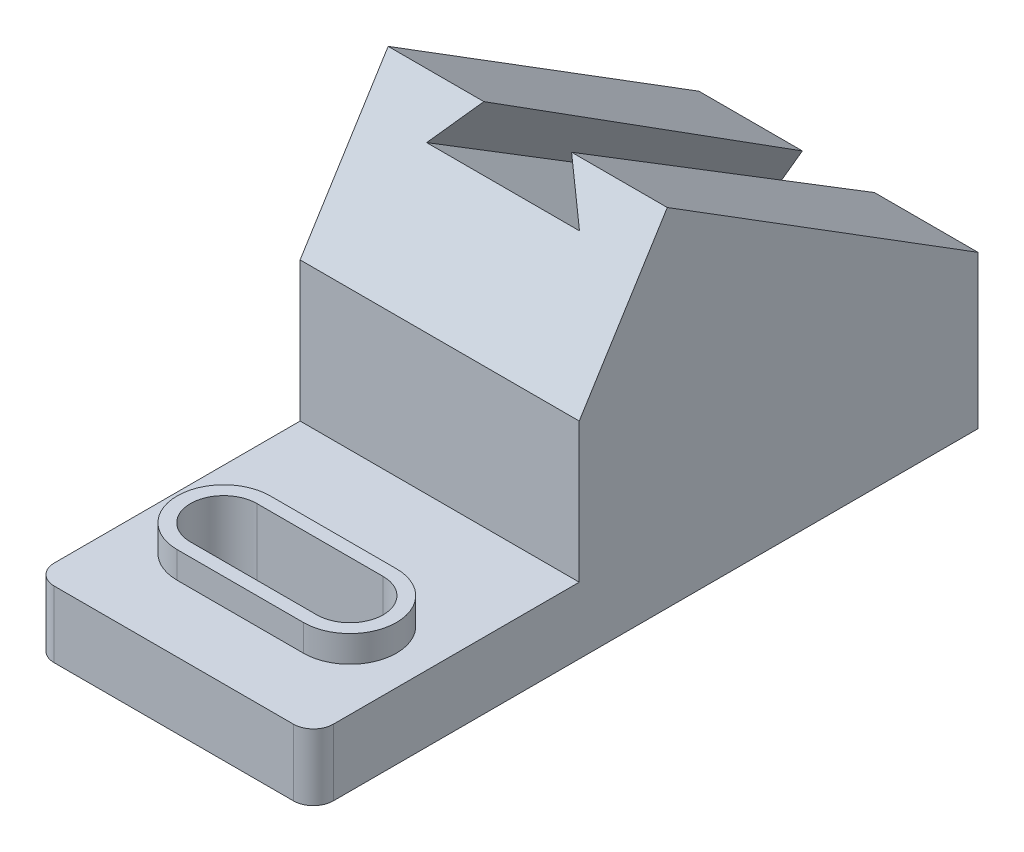
ISO-10303-21;
HEADER;
FILE_DESCRIPTION(('STEP AP214'),'2;1');
FILE_NAME('part.step','',(''),(''),'','','');
FILE_SCHEMA(('AUTOMOTIVE_DESIGN { 1 0 10303 214 1 1 1 1 }'));
ENDSEC;
DATA;
#1=APPLICATION_CONTEXT('core data for automotive mechanical design processes');
#2=APPLICATION_PROTOCOL_DEFINITION('international standard','automotive_design',2000,#1);
#3=PRODUCT_CONTEXT('',#1,'mechanical');
#4=PRODUCT('Part','Part','',(#3));
#5=PRODUCT_RELATED_PRODUCT_CATEGORY('part','',(#4));
#6=PRODUCT_DEFINITION_FORMATION('','',#4);
#7=PRODUCT_DEFINITION_CONTEXT('part definition',#1,'design');
#8=PRODUCT_DEFINITION('design','',#6,#7);
#9=PRODUCT_DEFINITION_SHAPE('','',#8);
#10=(LENGTH_UNIT() NAMED_UNIT(*) SI_UNIT(.MILLI.,.METRE.));
#11=(NAMED_UNIT(*) PLANE_ANGLE_UNIT() SI_UNIT($,.RADIAN.));
#12=(NAMED_UNIT(*) SI_UNIT($,.STERADIAN.) SOLID_ANGLE_UNIT());
#13=UNCERTAINTY_MEASURE_WITH_UNIT(LENGTH_MEASURE(1.E-05),#10,'distance_accuracy_value','');
#14=(GEOMETRIC_REPRESENTATION_CONTEXT(3) GLOBAL_UNCERTAINTY_ASSIGNED_CONTEXT((#13)) GLOBAL_UNIT_ASSIGNED_CONTEXT((#10,
#11,#12)) REPRESENTATION_CONTEXT('',''));
#15=CARTESIAN_POINT('',(0.,0.,0.));
#16=DIRECTION('',(0.,0.,1.));
#17=DIRECTION('',(1.,0.,0.));
#18=AXIS2_PLACEMENT_3D('',#15,#16,#17);
#19=CARTESIAN_POINT('',(21.,9.99999999999999,100.));
#20=DIRECTION('',(0.,-1.,0.));
#21=DIRECTION('',(0.,0.,-1.));
#22=AXIS2_PLACEMENT_3D('',#19,#20,#21);
#23=PLANE('',#22);
#24=DIRECTION('',(0.,0.,1.));
#25=VECTOR('',#24,1.);
#26=CARTESIAN_POINT('',(-21.,9.99999999999999,100.));
#27=LINE('',#26,#25);
#28=CARTESIAN_POINT('',(-21.,9.99999999999999,60.));
#29=VERTEX_POINT('',#28);
#30=CARTESIAN_POINT('',(-21.,9.99999999999999,97.));
#31=VERTEX_POINT('',#30);
#32=EDGE_CURVE('E350',#29,#31,#27,.T.);
#33=ORIENTED_EDGE('',*,*,#32,.T.);
#34=CARTESIAN_POINT('',(-18.,9.99999999999999,97.));
#35=DIRECTION('',(0.,1.,0.));
#36=DIRECTION('',(0.,0.,1.));
#37=AXIS2_PLACEMENT_3D('',#34,#35,#36);
#38=CIRCLE('',#37,3.);
#39=CARTESIAN_POINT('',(-18.,9.99999999999999,100.));
#40=VERTEX_POINT('',#39);
#41=EDGE_CURVE('E284',#31,#40,#38,.T.);
#42=ORIENTED_EDGE('',*,*,#41,.T.);
#43=DIRECTION('',(-1.,0.,0.));
#44=VECTOR('',#43,1.);
#45=CARTESIAN_POINT('',(21.,9.99999999999999,100.));
#46=LINE('',#45,#44);
#47=CARTESIAN_POINT('',(18.,9.99999999999999,100.));
#48=VERTEX_POINT('',#47);
#49=EDGE_CURVE('E357',#48,#40,#46,.T.);
#50=ORIENTED_EDGE('',*,*,#49,.F.);
#51=CARTESIAN_POINT('',(18.,9.99999999999999,97.));
#52=DIRECTION('',(0.,1.,0.));
#53=DIRECTION('',(0.,0.,1.));
#54=AXIS2_PLACEMENT_3D('',#51,#52,#53);
#55=CIRCLE('',#54,2.99999999999999);
#56=CARTESIAN_POINT('',(21.,9.99999999999999,97.));
#57=VERTEX_POINT('',#56);
#58=EDGE_CURVE('E270',#57,#48,#55,.F.);
#59=ORIENTED_EDGE('',*,*,#58,.F.);
#60=DIRECTION('',(0.,0.,1.));
#61=VECTOR('',#60,1.);
#62=CARTESIAN_POINT('',(21.,9.99999999999999,100.));
#63=LINE('',#62,#61);
#64=CARTESIAN_POINT('',(21.,9.99999999999999,60.));
#65=VERTEX_POINT('',#64);
#66=EDGE_CURVE('E335',#65,#57,#63,.T.);
#67=ORIENTED_EDGE('',*,*,#66,.F.);
#68=DIRECTION('',(-1.,0.,0.));
#69=VECTOR('',#68,1.);
#70=CARTESIAN_POINT('',(21.,9.99999999999999,60.));
#71=LINE('',#70,#69);
#72=EDGE_CURVE('E356',#65,#29,#71,.T.);
#73=ORIENTED_EDGE('',*,*,#72,.T.);
#74=EDGE_LOOP('',(#33,#42,#50,#59,#67,#73));
#75=FACE_BOUND('',#74,.T.);
#76=CARTESIAN_POINT('',(-9.5,9.99999999999999,83.));
#77=DIRECTION('',(0.,1.,0.));
#78=DIRECTION('',(0.,0.,1.));
#79=AXIS2_PLACEMENT_3D('',#76,#77,#78);
#80=CIRCLE('',#79,7.00000000000001);
#81=CARTESIAN_POINT('',(-9.5,9.99999999999999,76.));
#82=VERTEX_POINT('',#81);
#83=CARTESIAN_POINT('',(-9.5,9.99999999999999,90.));
#84=VERTEX_POINT('',#83);
#85=EDGE_CURVE('E79',#82,#84,#80,.T.);
#86=ORIENTED_EDGE('',*,*,#85,.F.);
#87=DIRECTION('',(1.,0.,0.));
#88=VECTOR('',#87,1.);
#89=CARTESIAN_POINT('',(0.,9.99999999999999,76.));
#90=LINE('',#89,#88);
#91=CARTESIAN_POINT('',(9.5,9.99999999999999,76.));
#92=VERTEX_POINT('',#91);
#93=EDGE_CURVE('E252',#82,#92,#90,.T.);
#94=ORIENTED_EDGE('',*,*,#93,.T.);
#95=CARTESIAN_POINT('',(9.5,9.99999999999999,83.));
#96=DIRECTION('',(0.,1.,0.));
#97=DIRECTION('',(0.,0.,1.));
#98=AXIS2_PLACEMENT_3D('',#95,#96,#97);
#99=CIRCLE('',#98,7.00000000000001);
#100=CARTESIAN_POINT('',(9.5,9.99999999999999,90.));
#101=VERTEX_POINT('',#100);
#102=EDGE_CURVE('E232',#101,#92,#99,.T.);
#103=ORIENTED_EDGE('',*,*,#102,.F.);
#104=DIRECTION('',(1.,0.,0.));
#105=VECTOR('',#104,1.);
#106=CARTESIAN_POINT('',(0.,9.99999999999999,90.));
#107=LINE('',#106,#105);
#108=EDGE_CURVE('E83',#84,#101,#107,.T.);
#109=ORIENTED_EDGE('',*,*,#108,.F.);
#110=EDGE_LOOP('',(#86,#94,#103,#109));
#111=FACE_BOUND('',#110,.T.);
#112=ADVANCED_FACE('F64',(#75,#111),#23,.F.);
#113=CARTESIAN_POINT('',(21.,0.,100.));
#114=DIRECTION('',(0.,0.,-1.));
#115=DIRECTION('',(-1.,0.,0.));
#116=AXIS2_PLACEMENT_3D('',#113,#114,#115);
#117=PLANE('',#116);
#118=DIRECTION('',(0.,1.,0.));
#119=VECTOR('',#118,1.);
#120=CARTESIAN_POINT('',(-18.,-0.00100000000001141,100.));
#121=LINE('',#120,#119);
#122=CARTESIAN_POINT('',(-18.,0.,100.));
#123=VERTEX_POINT('',#122);
#124=EDGE_CURVE('E275',#123,#40,#121,.T.);
#125=ORIENTED_EDGE('',*,*,#124,.F.);
#126=DIRECTION('',(-1.,0.,0.));
#127=VECTOR('',#126,1.);
#128=CARTESIAN_POINT('',(21.,0.,100.));
#129=LINE('',#128,#127);
#130=CARTESIAN_POINT('',(18.,0.,100.));
#131=VERTEX_POINT('',#130);
#132=EDGE_CURVE('E352',#131,#123,#129,.T.);
#133=ORIENTED_EDGE('',*,*,#132,.F.);
#134=DIRECTION('',(0.,1.,0.));
#135=VECTOR('',#134,1.);
#136=CARTESIAN_POINT('',(18.,-0.00100000000001141,100.));
#137=LINE('',#136,#135);
#138=EDGE_CURVE('E293',#131,#48,#137,.T.);
#139=ORIENTED_EDGE('',*,*,#138,.T.);
#140=ORIENTED_EDGE('',*,*,#49,.T.);
#141=EDGE_LOOP('',(#125,#133,#139,#140));
#142=FACE_BOUND('',#141,.T.);
#143=ADVANCED_FACE('F422',(#142),#117,.F.);
#144=CARTESIAN_POINT('',(21.,0.,0.));
#145=DIRECTION('',(0.,1.,0.));
#146=DIRECTION('',(0.,0.,1.));
#147=AXIS2_PLACEMENT_3D('',#144,#145,#146);
#148=PLANE('',#147);
#149=CARTESIAN_POINT('',(-9.5,0.,83.));
#150=DIRECTION('',(0.,1.,0.));
#151=DIRECTION('',(0.,0.,1.));
#152=AXIS2_PLACEMENT_3D('',#149,#150,#151);
#153=CIRCLE('',#152,5.);
#154=CARTESIAN_POINT('',(-9.5,0.,88.));
#155=VERTEX_POINT('',#154);
#156=CARTESIAN_POINT('',(-9.5,0.,78.));
#157=VERTEX_POINT('',#156);
#158=EDGE_CURVE('E271',#155,#157,#153,.F.);
#159=ORIENTED_EDGE('',*,*,#158,.F.);
#160=DIRECTION('',(-1.,0.,0.));
#161=VECTOR('',#160,1.);
#162=CARTESIAN_POINT('',(0.,0.,88.));
#163=LINE('',#162,#161);
#164=CARTESIAN_POINT('',(9.5,0.,88.));
#165=VERTEX_POINT('',#164);
#166=EDGE_CURVE('E218',#165,#155,#163,.T.);
#167=ORIENTED_EDGE('',*,*,#166,.F.);
#168=CARTESIAN_POINT('',(9.5,0.,83.));
#169=DIRECTION('',(0.,1.,0.));
#170=DIRECTION('',(0.,0.,1.));
#171=AXIS2_PLACEMENT_3D('',#168,#169,#170);
#172=CIRCLE('',#171,5.);
#173=CARTESIAN_POINT('',(9.5,0.,78.));
#174=VERTEX_POINT('',#173);
#175=EDGE_CURVE('E213',#174,#165,#172,.F.);
#176=ORIENTED_EDGE('',*,*,#175,.F.);
#177=DIRECTION('',(-1.,0.,0.));
#178=VECTOR('',#177,1.);
#179=CARTESIAN_POINT('',(0.,0.,78.));
#180=LINE('',#179,#178);
#181=EDGE_CURVE('E268',#174,#157,#180,.T.);
#182=ORIENTED_EDGE('',*,*,#181,.T.);
#183=EDGE_LOOP('',(#159,#167,#176,#182));
#184=FACE_BOUND('',#183,.T.);
#185=ORIENTED_EDGE('',*,*,#132,.T.);
#186=CARTESIAN_POINT('',(-18.,0.,97.));
#187=DIRECTION('',(0.,1.,0.));
#188=DIRECTION('',(0.,0.,1.));
#189=AXIS2_PLACEMENT_3D('',#186,#187,#188);
#190=CIRCLE('',#189,3.);
#191=CARTESIAN_POINT('',(-21.,0.,97.));
#192=VERTEX_POINT('',#191);
#193=EDGE_CURVE('E285',#123,#192,#190,.F.);
#194=ORIENTED_EDGE('',*,*,#193,.T.);
#195=DIRECTION('',(0.,0.,-1.));
#196=VECTOR('',#195,1.);
#197=CARTESIAN_POINT('',(-21.,0.,0.));
#198=LINE('',#197,#196);
#199=CARTESIAN_POINT('',(-21.,0.,0.));
#200=VERTEX_POINT('',#199);
#201=EDGE_CURVE('E326',#192,#200,#198,.T.);
#202=ORIENTED_EDGE('',*,*,#201,.T.);
#203=DIRECTION('',(-1.,0.,0.));
#204=VECTOR('',#203,1.);
#205=CARTESIAN_POINT('',(21.,0.,0.));
#206=LINE('',#205,#204);
#207=CARTESIAN_POINT('',(21.,0.,0.));
#208=VERTEX_POINT('',#207);
#209=EDGE_CURVE('E340',#208,#200,#206,.T.);
#210=ORIENTED_EDGE('',*,*,#209,.F.);
#211=DIRECTION('',(0.,0.,-1.));
#212=VECTOR('',#211,1.);
#213=CARTESIAN_POINT('',(21.,0.,0.));
#214=LINE('',#213,#212);
#215=CARTESIAN_POINT('',(21.,0.,97.));
#216=VERTEX_POINT('',#215);
#217=EDGE_CURVE('E333',#216,#208,#214,.T.);
#218=ORIENTED_EDGE('',*,*,#217,.F.);
#219=CARTESIAN_POINT('',(18.,0.,97.));
#220=DIRECTION('',(0.,1.,0.));
#221=DIRECTION('',(0.,0.,1.));
#222=AXIS2_PLACEMENT_3D('',#219,#220,#221);
#223=CIRCLE('',#222,2.99999999999999);
#224=EDGE_CURVE('E287',#131,#216,#223,.T.);
#225=ORIENTED_EDGE('',*,*,#224,.F.);
#226=EDGE_LOOP('',(#185,#194,#202,#210,#218,#225));
#227=FACE_BOUND('',#226,.T.);
#228=ADVANCED_FACE('F419',(#184,#227),#148,.F.);
#229=CARTESIAN_POINT('',(21.,0.,0.));
#230=DIRECTION('',(-1.,0.,0.));
#231=DIRECTION('',(0.,0.,1.));
#232=AXIS2_PLACEMENT_3D('',#229,#230,#231);
#233=PLANE('',#232);
#234=DIRECTION('',(0.,1.,0.));
#235=VECTOR('',#234,1.);
#236=CARTESIAN_POINT('',(21.,-0.00100000000001141,97.));
#237=LINE('',#236,#235);
#238=EDGE_CURVE('E294',#216,#57,#237,.T.);
#239=ORIENTED_EDGE('',*,*,#238,.F.);
#240=ORIENTED_EDGE('',*,*,#217,.T.);
#241=DIRECTION('',(0.,1.,0.));
#242=VECTOR('',#241,1.);
#243=CARTESIAN_POINT('',(21.,22.9872989694932,0.));
#244=LINE('',#243,#242);
#245=CARTESIAN_POINT('',(21.,22.9872989694932,0.));
#246=VERTEX_POINT('',#245);
#247=EDGE_CURVE('E325',#208,#246,#244,.T.);
#248=ORIENTED_EDGE('',*,*,#247,.T.);
#249=DIRECTION('',(0.,0.5299192642332,0.848048096156429));
#250=VECTOR('',#249,1.);
#251=CARTESIAN_POINT('',(21.,52.2012024039107,46.75201839417));
#252=LINE('',#251,#250);
#253=CARTESIAN_POINT('',(21.,52.2012024039107,46.75201839417));
#254=VERTEX_POINT('',#253);
#255=EDGE_CURVE('E324',#246,#254,#252,.T.);
#256=ORIENTED_EDGE('',*,*,#255,.T.);
#257=DIRECTION('',(0.,-0.84804809615643,0.529919264233199));
#258=VECTOR('',#257,1.);
#259=CARTESIAN_POINT('',(21.,31.,60.));
#260=LINE('',#259,#258);
#261=CARTESIAN_POINT('',(21.,31.,60.));
#262=VERTEX_POINT('',#261);
#263=EDGE_CURVE('E327',#254,#262,#260,.T.);
#264=ORIENTED_EDGE('',*,*,#263,.T.);
#265=DIRECTION('',(0.,-1.,0.));
#266=VECTOR('',#265,1.);
#267=CARTESIAN_POINT('',(21.,9.99999999999999,60.));
#268=LINE('',#267,#266);
#269=EDGE_CURVE('E329',#262,#65,#268,.T.);
#270=ORIENTED_EDGE('',*,*,#269,.T.);
#271=ORIENTED_EDGE('',*,*,#66,.T.);
#272=EDGE_LOOP('',(#239,#240,#248,#256,#264,#270,#271));
#273=FACE_BOUND('',#272,.T.);
#274=ADVANCED_FACE('F387',(#273),#233,.F.);
#275=CARTESIAN_POINT('',(-21.,0.,0.));
#276=DIRECTION('',(-1.,0.,0.));
#277=DIRECTION('',(0.,0.,1.));
#278=AXIS2_PLACEMENT_3D('',#275,#276,#277);
#279=PLANE('',#278);
#280=ORIENTED_EDGE('',*,*,#201,.F.);
#281=DIRECTION('',(0.,1.,0.));
#282=VECTOR('',#281,1.);
#283=CARTESIAN_POINT('',(-21.,-0.00100000000001141,97.));
#284=LINE('',#283,#282);
#285=EDGE_CURVE('E286',#192,#31,#284,.T.);
#286=ORIENTED_EDGE('',*,*,#285,.T.);
#287=ORIENTED_EDGE('',*,*,#32,.F.);
#288=DIRECTION('',(0.,-1.,0.));
#289=VECTOR('',#288,1.);
#290=CARTESIAN_POINT('',(-21.,9.99999999999999,60.));
#291=LINE('',#290,#289);
#292=CARTESIAN_POINT('',(-21.,31.,60.));
#293=VERTEX_POINT('',#292);
#294=EDGE_CURVE('E343',#293,#29,#291,.T.);
#295=ORIENTED_EDGE('',*,*,#294,.F.);
#296=DIRECTION('',(0.,-0.84804809615643,0.529919264233199));
#297=VECTOR('',#296,1.);
#298=CARTESIAN_POINT('',(-21.,31.,60.));
#299=LINE('',#298,#297);
#300=CARTESIAN_POINT('',(-21.,52.2012024039107,46.75201839417));
#301=VERTEX_POINT('',#300);
#302=EDGE_CURVE('E345',#301,#293,#299,.T.);
#303=ORIENTED_EDGE('',*,*,#302,.F.);
#304=DIRECTION('',(0.,0.5299192642332,0.848048096156429));
#305=VECTOR('',#304,1.);
#306=CARTESIAN_POINT('',(-21.,52.2012024039107,46.75201839417));
#307=LINE('',#306,#305);
#308=CARTESIAN_POINT('',(-21.,22.9872989694932,0.));
#309=VERTEX_POINT('',#308);
#310=EDGE_CURVE('E339',#309,#301,#307,.T.);
#311=ORIENTED_EDGE('',*,*,#310,.F.);
#312=DIRECTION('',(0.,1.,0.));
#313=VECTOR('',#312,1.);
#314=CARTESIAN_POINT('',(-21.,22.9872989694932,0.));
#315=LINE('',#314,#313);
#316=EDGE_CURVE('E321',#200,#309,#315,.T.);
#317=ORIENTED_EDGE('',*,*,#316,.F.);
#318=EDGE_LOOP('',(#280,#286,#287,#295,#303,#311,#317));
#319=FACE_BOUND('',#318,.T.);
#320=ADVANCED_FACE('F408',(#319),#279,.T.);
#321=CARTESIAN_POINT('',(21.,52.2012024039107,46.75201839417));
#322=DIRECTION('',(0.,-0.848048096156429,0.5299192642332));
#323=DIRECTION('',(0.,-0.5299192642332,-0.848048096156429));
#324=AXIS2_PLACEMENT_3D('',#321,#322,#323);
#325=PLANE('',#324);
#326=DIRECTION('',(-1.,0.,0.));
#327=VECTOR('',#326,1.);
#328=CARTESIAN_POINT('',(21.,52.2012024039107,46.75201839417));
#329=LINE('',#328,#327);
#330=CARTESIAN_POINT('',(-6.598547232532,52.2012024039108,46.7520183941701));
#331=VERTEX_POINT('',#330);
#332=EDGE_CURVE('E364',#331,#301,#329,.T.);
#333=ORIENTED_EDGE('',*,*,#332,.F.);
#334=DIRECTION('',(0.0213038636350149,-0.529798997436359,-0.847855629048749));
#335=VECTOR('',#334,1.);
#336=CARTESIAN_POINT('',(-6.5860215047577,51.8897040705249,46.2535168555139));
#337=LINE('',#336,#335);
#338=CARTESIAN_POINT('',(-5.42382055689671,22.9872989694932,0.));
#339=VERTEX_POINT('',#338);
#340=EDGE_CURVE('E12',#331,#339,#337,.T.);
#341=ORIENTED_EDGE('',*,*,#340,.T.);
#342=DIRECTION('',(-1.,0.,0.));
#343=VECTOR('',#342,1.);
#344=CARTESIAN_POINT('',(21.,22.9872989694932,0.));
#345=LINE('',#344,#343);
#346=EDGE_CURVE('E369',#339,#309,#345,.T.);
#347=ORIENTED_EDGE('',*,*,#346,.T.);
#348=ORIENTED_EDGE('',*,*,#310,.T.);
#349=EDGE_LOOP('',(#333,#341,#347,#348));
#350=FACE_BOUND('',#349,.T.);
#351=ADVANCED_FACE('F405',(#350),#325,.F.);
#352=CARTESIAN_POINT('',(21.,31.,60.));
#353=DIRECTION('',(0.,-0.529919264233199,-0.84804809615643));
#354=DIRECTION('',(0.,0.84804809615643,-0.529919264233199));
#355=AXIS2_PLACEMENT_3D('',#352,#353,#354);
#356=PLANE('',#355);
#357=DIRECTION('',(-0.573576436351049,0.694680331621925,-0.434084448604742));
#358=VECTOR('',#357,1.);
#359=CARTESIAN_POINT('',(13.5870330842896,43.7371802416356,52.040926437257));
#360=LINE('',#359,#358);
#361=CARTESIAN_POINT('',(11.5,46.2648657308158,50.4614532438025));
#362=VERTEX_POINT('',#361);
#363=CARTESIAN_POINT('',(6.59854723253199,52.2012024039108,46.7520183941701));
#364=VERTEX_POINT('',#363);
#365=EDGE_CURVE('E304',#362,#364,#360,.T.);
#366=ORIENTED_EDGE('',*,*,#365,.F.);
#367=DIRECTION('',(1.,0.,0.));
#368=VECTOR('',#367,1.);
#369=CARTESIAN_POINT('',(0.,46.2648657308158,50.4614532438025));
#370=LINE('',#369,#368);
#371=CARTESIAN_POINT('',(-11.5,46.2648657308157,50.4614532438024));
#372=VERTEX_POINT('',#371);
#373=EDGE_CURVE('E281',#372,#362,#370,.T.);
#374=ORIENTED_EDGE('',*,*,#373,.F.);
#375=DIRECTION('',(-0.573576436351049,-0.694680331621925,0.434084448604743));
#376=VECTOR('',#375,1.);
#377=CARTESIAN_POINT('',(-13.5870330842896,43.7371802416356,52.040926437257));
#378=LINE('',#377,#376);
#379=EDGE_CURVE('E303',#331,#372,#378,.T.);
#380=ORIENTED_EDGE('',*,*,#379,.F.);
#381=ORIENTED_EDGE('',*,*,#332,.T.);
#382=ORIENTED_EDGE('',*,*,#302,.T.);
#383=DIRECTION('',(-1.,0.,0.));
#384=VECTOR('',#383,1.);
#385=CARTESIAN_POINT('',(21.,31.,60.));
#386=LINE('',#385,#384);
#387=EDGE_CURVE('E362',#262,#293,#386,.T.);
#388=ORIENTED_EDGE('',*,*,#387,.F.);
#389=ORIENTED_EDGE('',*,*,#263,.F.);
#390=EDGE_CURVE('E368',#254,#364,#329,.T.);
#391=ORIENTED_EDGE('',*,*,#390,.T.);
#392=EDGE_LOOP('',(#366,#374,#380,#381,#382,#388,#389,#391));
#393=FACE_BOUND('',#392,.T.);
#394=ADVANCED_FACE('F379',(#393),#356,.F.);
#395=CARTESIAN_POINT('',(21.,22.9872989694932,0.));
#396=DIRECTION('',(0.,0.,1.));
#397=DIRECTION('',(1.,0.,0.));
#398=AXIS2_PLACEMENT_3D('',#395,#396,#397);
#399=PLANE('',#398);
#400=ORIENTED_EDGE('',*,*,#346,.F.);
#401=DIRECTION('',(-0.503345139345081,-0.864085453353823,0.));
#402=VECTOR('',#401,1.);
#403=CARTESIAN_POINT('',(1.2708216255418,34.479896142043,0.));
#404=LINE('',#403,#402);
#405=CARTESIAN_POINT('',(-9.52633790202085,15.9445656977148,0.));
#406=VERTEX_POINT('',#405);
#407=EDGE_CURVE('E318',#339,#406,#404,.T.);
#408=ORIENTED_EDGE('',*,*,#407,.T.);
#409=DIRECTION('',(1.,0.,0.));
#410=VECTOR('',#409,1.);
#411=CARTESIAN_POINT('',(21.,15.9445656977148,0.));
#412=LINE('',#411,#410);
#413=CARTESIAN_POINT('',(9.52633790202085,15.9445656977148,0.));
#414=VERTEX_POINT('',#413);
#415=EDGE_CURVE('E313',#406,#414,#412,.T.);
#416=ORIENTED_EDGE('',*,*,#415,.T.);
#417=DIRECTION('',(-0.503345139345081,0.864085453353822,0.));
#418=VECTOR('',#417,1.);
#419=CARTESIAN_POINT('',(9.37014420515559,16.2127011992167,0.));
#420=LINE('',#419,#418);
#421=CARTESIAN_POINT('',(5.4238205568967,22.9872989694931,0.));
#422=VERTEX_POINT('',#421);
#423=EDGE_CURVE('E312',#414,#422,#420,.T.);
#424=ORIENTED_EDGE('',*,*,#423,.T.);
#425=EDGE_CURVE('E306',#246,#422,#345,.T.);
#426=ORIENTED_EDGE('',*,*,#425,.F.);
#427=ORIENTED_EDGE('',*,*,#247,.F.);
#428=ORIENTED_EDGE('',*,*,#209,.T.);
#429=ORIENTED_EDGE('',*,*,#316,.T.);
#430=EDGE_LOOP('',(#400,#408,#416,#424,#426,#427,#428,#429));
#431=FACE_BOUND('',#430,.T.);
#432=ADVANCED_FACE('F69',(#431),#399,.F.);
#433=ORIENTED_EDGE('',*,*,#425,.T.);
#434=DIRECTION('',(0.0213038636350149,0.529798997436359,0.847855629048749));
#435=VECTOR('',#434,1.);
#436=CARTESIAN_POINT('',(6.60508339820042,52.3637482255297,47.0121460850582));
#437=LINE('',#436,#435);
#438=EDGE_CURVE('E71',#422,#364,#437,.T.);
#439=ORIENTED_EDGE('',*,*,#438,.T.);
#440=ORIENTED_EDGE('',*,*,#390,.F.);
#441=ORIENTED_EDGE('',*,*,#255,.F.);
#442=EDGE_LOOP('',(#433,#439,#440,#441));
#443=FACE_BOUND('',#442,.T.);
#444=ADVANCED_FACE('F372',(#443),#325,.F.);
#445=CARTESIAN_POINT('',(21.,9.99999999999999,60.));
#446=DIRECTION('',(0.,0.,-1.));
#447=DIRECTION('',(-1.,0.,0.));
#448=AXIS2_PLACEMENT_3D('',#445,#446,#447);
#449=PLANE('',#448);
#450=ORIENTED_EDGE('',*,*,#294,.T.);
#451=ORIENTED_EDGE('',*,*,#72,.F.);
#452=ORIENTED_EDGE('',*,*,#269,.F.);
#453=ORIENTED_EDGE('',*,*,#387,.T.);
#454=EDGE_LOOP('',(#450,#451,#452,#453));
#455=FACE_BOUND('',#454,.T.);
#456=ADVANCED_FACE('F414',(#455),#449,.F.);
#457=CARTESIAN_POINT('',(-13.5870330842896,43.7371802416356,52.040926437257));
#458=DIRECTION('',(-0.819027283464993,0.477097954285664,-0.318703390249287));
#459=DIRECTION('',(0.0142961744108631,-0.538327761567325,-0.842614289294412));
#460=AXIS2_PLACEMENT_3D('',#457,#458,#459);
#461=PLANE('',#460);
#462=ORIENTED_EDGE('',*,*,#340,.F.);
#463=ORIENTED_EDGE('',*,*,#379,.T.);
#464=DIRECTION('',(-0.0335069356204946,0.514748873296714,0.85668598839078));
#465=VECTOR('',#464,1.);
#466=CARTESIAN_POINT('',(-11.5040851447985,46.3276235940261,50.5658998678996));
#467=LINE('',#466,#465);
#468=EDGE_CURVE('E310',#406,#372,#467,.T.);
#469=ORIENTED_EDGE('',*,*,#468,.F.);
#470=ORIENTED_EDGE('',*,*,#407,.F.);
#471=EDGE_LOOP('',(#462,#463,#469,#470));
#472=FACE_BOUND('',#471,.T.);
#473=ADVANCED_FACE('F452',(#472),#461,.F.);
#474=CARTESIAN_POINT('',(13.5870330842896,43.7371802416356,52.040926437257));
#475=DIRECTION('',(0.819027283464992,0.477097954285664,-0.318703390249287));
#476=DIRECTION('',(-0.0142961744108631,-0.538327761567325,-0.842614289294412));
#477=AXIS2_PLACEMENT_3D('',#474,#475,#476);
#478=PLANE('',#477);
#479=DIRECTION('',(0.0335069356204946,0.514748873296714,0.85668598839078));
#480=VECTOR('',#479,1.);
#481=CARTESIAN_POINT('',(11.4870887805512,46.0665176711956,50.1313466378126));
#482=LINE('',#481,#480);
#483=EDGE_CURVE('E301',#414,#362,#482,.T.);
#484=ORIENTED_EDGE('',*,*,#483,.T.);
#485=ORIENTED_EDGE('',*,*,#365,.T.);
#486=ORIENTED_EDGE('',*,*,#438,.F.);
#487=ORIENTED_EDGE('',*,*,#423,.F.);
#488=EDGE_LOOP('',(#484,#485,#486,#487));
#489=FACE_BOUND('',#488,.T.);
#490=ADVANCED_FACE('F393',(#489),#478,.F.);
#491=CARTESIAN_POINT('',(0.,46.2648657308158,50.4614532438025));
#492=DIRECTION('',(0.,-0.857167300702116,0.515038074910048));
#493=DIRECTION('',(0.,-0.515038074910048,-0.857167300702116));
#494=AXIS2_PLACEMENT_3D('',#491,#492,#493);
#495=PLANE('',#494);
#496=ORIENTED_EDGE('',*,*,#468,.T.);
#497=ORIENTED_EDGE('',*,*,#373,.T.);
#498=ORIENTED_EDGE('',*,*,#483,.F.);
#499=ORIENTED_EDGE('',*,*,#415,.F.);
#500=EDGE_LOOP('',(#496,#497,#498,#499));
#501=FACE_BOUND('',#500,.T.);
#502=ADVANCED_FACE('F397',(#501),#495,.F.);
#503=CARTESIAN_POINT('',(0.,-0.00100000000001141,88.));
#504=DIRECTION('',(0.,0.,1.));
#505=DIRECTION('',(1.,0.,0.));
#506=AXIS2_PLACEMENT_3D('',#503,#504,#505);
#507=PLANE('',#506);
#508=ORIENTED_EDGE('',*,*,#166,.T.);
#509=DIRECTION('',(0.,1.,0.));
#510=VECTOR('',#509,1.);
#511=CARTESIAN_POINT('',(-9.5,-0.00100000000001141,88.));
#512=LINE('',#511,#510);
#513=CARTESIAN_POINT('',(-9.5,14.,88.));
#514=VERTEX_POINT('',#513);
#515=EDGE_CURVE('E231',#155,#514,#512,.T.);
#516=ORIENTED_EDGE('',*,*,#515,.T.);
#517=DIRECTION('',(1.,0.,0.));
#518=VECTOR('',#517,1.);
#519=CARTESIAN_POINT('',(0.,14.,88.));
#520=LINE('',#519,#518);
#521=CARTESIAN_POINT('',(9.5,14.,88.));
#522=VERTEX_POINT('',#521);
#523=EDGE_CURVE('E230',#514,#522,#520,.T.);
#524=ORIENTED_EDGE('',*,*,#523,.T.);
#525=DIRECTION('',(0.,1.,0.));
#526=VECTOR('',#525,1.);
#527=CARTESIAN_POINT('',(9.5,-0.00100000000001141,88.));
#528=LINE('',#527,#526);
#529=EDGE_CURVE('E210',#165,#522,#528,.T.);
#530=ORIENTED_EDGE('',*,*,#529,.F.);
#531=EDGE_LOOP('',(#508,#516,#524,#530));
#532=FACE_BOUND('',#531,.T.);
#533=ADVANCED_FACE('F235',(#532),#507,.F.);
#534=CARTESIAN_POINT('',(-9.5,-0.00100000000001141,83.));
#535=DIRECTION('',(0.,1.,0.));
#536=DIRECTION('',(0.,0.,1.));
#537=AXIS2_PLACEMENT_3D('',#534,#535,#536);
#538=CYLINDRICAL_SURFACE('',#537,5.);
#539=ORIENTED_EDGE('',*,*,#158,.T.);
#540=DIRECTION('',(0.,1.,0.));
#541=VECTOR('',#540,1.);
#542=CARTESIAN_POINT('',(-9.5,-0.00100000000001141,78.));
#543=LINE('',#542,#541);
#544=CARTESIAN_POINT('',(-9.5,14.,78.));
#545=VERTEX_POINT('',#544);
#546=EDGE_CURVE('E280',#157,#545,#543,.T.);
#547=ORIENTED_EDGE('',*,*,#546,.T.);
#548=CARTESIAN_POINT('',(-9.5,14.,83.));
#549=DIRECTION('',(0.,1.,0.));
#550=DIRECTION('',(0.,0.,1.));
#551=AXIS2_PLACEMENT_3D('',#548,#549,#550);
#552=CIRCLE('',#551,5.);
#553=EDGE_CURVE('E233',#545,#514,#552,.T.);
#554=ORIENTED_EDGE('',*,*,#553,.T.);
#555=ORIENTED_EDGE('',*,*,#515,.F.);
#556=EDGE_LOOP('',(#539,#547,#554,#555));
#557=FACE_BOUND('',#556,.T.);
#558=ADVANCED_FACE('F475',(#557),#538,.F.);
#559=CARTESIAN_POINT('',(0.,-0.00100000000001141,78.));
#560=DIRECTION('',(0.,0.,1.));
#561=DIRECTION('',(1.,0.,0.));
#562=AXIS2_PLACEMENT_3D('',#559,#560,#561);
#563=PLANE('',#562);
#564=DIRECTION('',(0.,1.,0.));
#565=VECTOR('',#564,1.);
#566=CARTESIAN_POINT('',(9.5,-0.00100000000001141,78.));
#567=LINE('',#566,#565);
#568=CARTESIAN_POINT('',(9.5,14.,78.));
#569=VERTEX_POINT('',#568);
#570=EDGE_CURVE('E217',#174,#569,#567,.T.);
#571=ORIENTED_EDGE('',*,*,#570,.T.);
#572=DIRECTION('',(1.,0.,0.));
#573=VECTOR('',#572,1.);
#574=CARTESIAN_POINT('',(0.,14.,78.));
#575=LINE('',#574,#573);
#576=EDGE_CURVE('E229',#545,#569,#575,.T.);
#577=ORIENTED_EDGE('',*,*,#576,.F.);
#578=ORIENTED_EDGE('',*,*,#546,.F.);
#579=ORIENTED_EDGE('',*,*,#181,.F.);
#580=EDGE_LOOP('',(#571,#577,#578,#579));
#581=FACE_BOUND('',#580,.T.);
#582=ADVANCED_FACE('F478',(#581),#563,.T.);
#583=CARTESIAN_POINT('',(9.5,-0.00100000000001141,83.));
#584=DIRECTION('',(0.,1.,0.));
#585=DIRECTION('',(0.,0.,1.));
#586=AXIS2_PLACEMENT_3D('',#583,#584,#585);
#587=CYLINDRICAL_SURFACE('',#586,5.);
#588=ORIENTED_EDGE('',*,*,#175,.T.);
#589=ORIENTED_EDGE('',*,*,#529,.T.);
#590=CARTESIAN_POINT('',(9.5,14.,83.));
#591=DIRECTION('',(0.,1.,0.));
#592=DIRECTION('',(0.,0.,1.));
#593=AXIS2_PLACEMENT_3D('',#590,#591,#592);
#594=CIRCLE('',#593,5.);
#595=EDGE_CURVE('E211',#522,#569,#594,.T.);
#596=ORIENTED_EDGE('',*,*,#595,.T.);
#597=ORIENTED_EDGE('',*,*,#570,.F.);
#598=EDGE_LOOP('',(#588,#589,#596,#597));
#599=FACE_BOUND('',#598,.T.);
#600=ADVANCED_FACE('F207',(#599),#587,.F.);
#601=CARTESIAN_POINT('',(-18.,-0.00100000000001141,97.));
#602=DIRECTION('',(0.,1.,0.));
#603=DIRECTION('',(0.,0.,1.));
#604=AXIS2_PLACEMENT_3D('',#601,#602,#603);
#605=CYLINDRICAL_SURFACE('',#604,3.);
#606=ORIENTED_EDGE('',*,*,#124,.T.);
#607=ORIENTED_EDGE('',*,*,#41,.F.);
#608=ORIENTED_EDGE('',*,*,#285,.F.);
#609=ORIENTED_EDGE('',*,*,#193,.F.);
#610=EDGE_LOOP('',(#606,#607,#608,#609));
#611=FACE_BOUND('',#610,.T.);
#612=ADVANCED_FACE('F427',(#611),#605,.T.);
#613=CARTESIAN_POINT('',(18.,-0.00100000000001141,97.));
#614=DIRECTION('',(0.,1.,0.));
#615=DIRECTION('',(0.,0.,1.));
#616=AXIS2_PLACEMENT_3D('',#613,#614,#615);
#617=CYLINDRICAL_SURFACE('',#616,2.99999999999999);
#618=ORIENTED_EDGE('',*,*,#224,.T.);
#619=ORIENTED_EDGE('',*,*,#238,.T.);
#620=ORIENTED_EDGE('',*,*,#58,.T.);
#621=ORIENTED_EDGE('',*,*,#138,.F.);
#622=EDGE_LOOP('',(#618,#619,#620,#621));
#623=FACE_BOUND('',#622,.T.);
#624=ADVANCED_FACE('F426',(#623),#617,.T.);
#625=CARTESIAN_POINT('',(0.,14.,76.));
#626=DIRECTION('',(0.,0.,-1.));
#627=DIRECTION('',(-1.,0.,0.));
#628=AXIS2_PLACEMENT_3D('',#625,#626,#627);
#629=PLANE('',#628);
#630=ORIENTED_EDGE('',*,*,#93,.F.);
#631=DIRECTION('',(0.,-1.,0.));
#632=VECTOR('',#631,1.);
#633=CARTESIAN_POINT('',(-9.5,14.,76.));
#634=LINE('',#633,#632);
#635=CARTESIAN_POINT('',(-9.5,14.,76.));
#636=VERTEX_POINT('',#635);
#637=EDGE_CURVE('E264',#636,#82,#634,.T.);
#638=ORIENTED_EDGE('',*,*,#637,.F.);
#639=DIRECTION('',(1.,0.,0.));
#640=VECTOR('',#639,1.);
#641=CARTESIAN_POINT('',(0.,14.,76.));
#642=LINE('',#641,#640);
#643=CARTESIAN_POINT('',(9.5,14.,76.));
#644=VERTEX_POINT('',#643);
#645=EDGE_CURVE('E238',#636,#644,#642,.T.);
#646=ORIENTED_EDGE('',*,*,#645,.T.);
#647=DIRECTION('',(0.,-1.,0.));
#648=VECTOR('',#647,1.);
#649=CARTESIAN_POINT('',(9.5,14.,76.));
#650=LINE('',#649,#648);
#651=EDGE_CURVE('E253',#644,#92,#650,.T.);
#652=ORIENTED_EDGE('',*,*,#651,.T.);
#653=EDGE_LOOP('',(#630,#638,#646,#652));
#654=FACE_BOUND('',#653,.T.);
#655=ADVANCED_FACE('F428',(#654),#629,.T.);
#656=CARTESIAN_POINT('',(-9.5,14.,83.));
#657=DIRECTION('',(0.,-1.,0.));
#658=DIRECTION('',(0.,0.,-1.));
#659=AXIS2_PLACEMENT_3D('',#656,#657,#658);
#660=CYLINDRICAL_SURFACE('',#659,7.00000000000001);
#661=ORIENTED_EDGE('',*,*,#85,.T.);
#662=DIRECTION('',(0.,-1.,0.));
#663=VECTOR('',#662,1.);
#664=CARTESIAN_POINT('',(-9.5,14.,90.));
#665=LINE('',#664,#663);
#666=CARTESIAN_POINT('',(-9.5,14.,90.));
#667=VERTEX_POINT('',#666);
#668=EDGE_CURVE('E263',#667,#84,#665,.T.);
#669=ORIENTED_EDGE('',*,*,#668,.F.);
#670=CARTESIAN_POINT('',(-9.5,14.,83.));
#671=DIRECTION('',(0.,1.,0.));
#672=DIRECTION('',(0.,0.,1.));
#673=AXIS2_PLACEMENT_3D('',#670,#671,#672);
#674=CIRCLE('',#673,7.00000000000001);
#675=EDGE_CURVE('E242',#636,#667,#674,.T.);
#676=ORIENTED_EDGE('',*,*,#675,.F.);
#677=ORIENTED_EDGE('',*,*,#637,.T.);
#678=EDGE_LOOP('',(#661,#669,#676,#677));
#679=FACE_BOUND('',#678,.T.);
#680=ADVANCED_FACE('F436',(#679),#660,.T.);
#681=CARTESIAN_POINT('',(0.,14.,90.));
#682=DIRECTION('',(0.,0.,-1.));
#683=DIRECTION('',(-1.,0.,0.));
#684=AXIS2_PLACEMENT_3D('',#681,#682,#683);
#685=PLANE('',#684);
#686=ORIENTED_EDGE('',*,*,#108,.T.);
#687=DIRECTION('',(0.,-1.,0.));
#688=VECTOR('',#687,1.);
#689=CARTESIAN_POINT('',(9.5,14.,90.));
#690=LINE('',#689,#688);
#691=CARTESIAN_POINT('',(9.5,14.,90.));
#692=VERTEX_POINT('',#691);
#693=EDGE_CURVE('E257',#692,#101,#690,.T.);
#694=ORIENTED_EDGE('',*,*,#693,.F.);
#695=DIRECTION('',(1.,0.,0.));
#696=VECTOR('',#695,1.);
#697=CARTESIAN_POINT('',(0.,14.,90.));
#698=LINE('',#697,#696);
#699=EDGE_CURVE('E247',#667,#692,#698,.T.);
#700=ORIENTED_EDGE('',*,*,#699,.F.);
#701=ORIENTED_EDGE('',*,*,#668,.T.);
#702=EDGE_LOOP('',(#686,#694,#700,#701));
#703=FACE_BOUND('',#702,.T.);
#704=ADVANCED_FACE('F584',(#703),#685,.F.);
#705=CARTESIAN_POINT('',(9.5,14.,83.));
#706=DIRECTION('',(0.,-1.,0.));
#707=DIRECTION('',(0.,0.,-1.));
#708=AXIS2_PLACEMENT_3D('',#705,#706,#707);
#709=CYLINDRICAL_SURFACE('',#708,7.00000000000001);
#710=ORIENTED_EDGE('',*,*,#102,.T.);
#711=ORIENTED_EDGE('',*,*,#651,.F.);
#712=CARTESIAN_POINT('',(9.5,14.,83.));
#713=DIRECTION('',(0.,1.,0.));
#714=DIRECTION('',(0.,0.,1.));
#715=AXIS2_PLACEMENT_3D('',#712,#713,#714);
#716=CIRCLE('',#715,7.00000000000001);
#717=EDGE_CURVE('E246',#692,#644,#716,.T.);
#718=ORIENTED_EDGE('',*,*,#717,.F.);
#719=ORIENTED_EDGE('',*,*,#693,.T.);
#720=EDGE_LOOP('',(#710,#711,#718,#719));
#721=FACE_BOUND('',#720,.T.);
#722=ADVANCED_FACE('F592',(#721),#709,.T.);
#723=CARTESIAN_POINT('',(0.,14.,0.));
#724=DIRECTION('',(0.,1.,0.));
#725=DIRECTION('',(0.,0.,1.));
#726=AXIS2_PLACEMENT_3D('',#723,#724,#725);
#727=PLANE('',#726);
#728=ORIENTED_EDGE('',*,*,#595,.F.);
#729=ORIENTED_EDGE('',*,*,#523,.F.);
#730=ORIENTED_EDGE('',*,*,#553,.F.);
#731=ORIENTED_EDGE('',*,*,#576,.T.);
#732=EDGE_LOOP('',(#728,#729,#730,#731));
#733=FACE_BOUND('',#732,.T.);
#734=ORIENTED_EDGE('',*,*,#645,.F.);
#735=ORIENTED_EDGE('',*,*,#675,.T.);
#736=ORIENTED_EDGE('',*,*,#699,.T.);
#737=ORIENTED_EDGE('',*,*,#717,.T.);
#738=EDGE_LOOP('',(#734,#735,#736,#737));
#739=FACE_BOUND('',#738,.T.);
#740=ADVANCED_FACE('F221',(#733,#739),#727,.T.);
#741=CLOSED_SHELL('',(#112,#143,#228,#274,#320,#351,#394,#432,#444,#456,#473,#490,#502,#533,
#558,#582,#600,#612,#624,#655,#680,#704,#722,#740));
#742=MANIFOLD_SOLID_BREP('B2',#741);
#743=ADVANCED_BREP_SHAPE_REPRESENTATION('',(#18,#742),#14);
#744=SHAPE_DEFINITION_REPRESENTATION(#9,#743);
ENDSEC;
END-ISO-10303-21;
